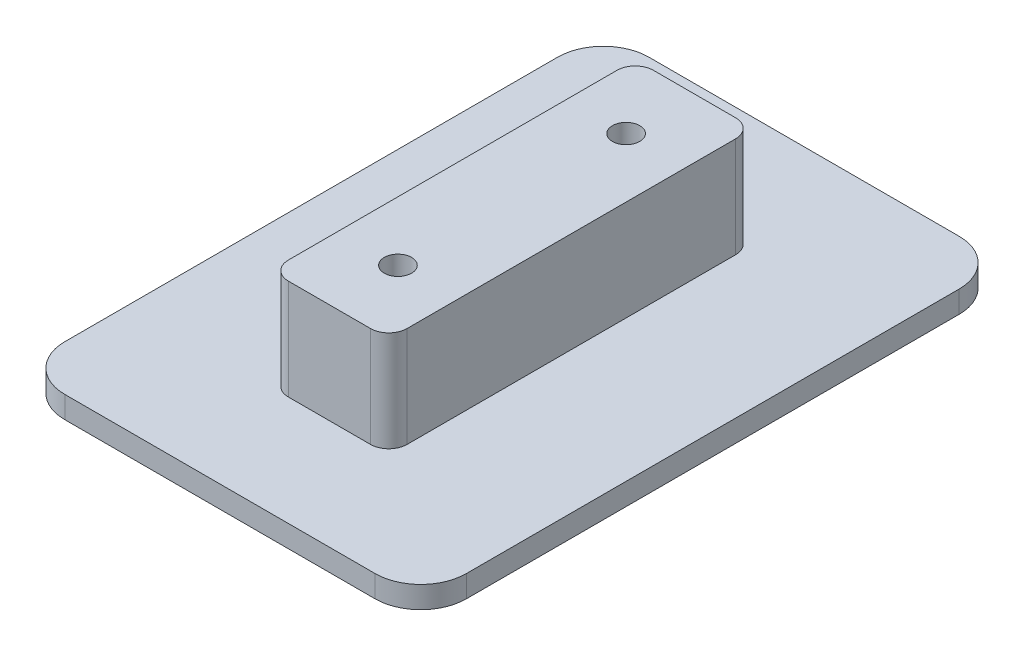
ISO-10303-21;
HEADER;
FILE_DESCRIPTION(('STEP AP214'),'2;1');
FILE_NAME('part.step','',(''),(''),'','','');
FILE_SCHEMA(('AUTOMOTIVE_DESIGN { 1 0 10303 214 1 1 1 1 }'));
ENDSEC;
DATA;
#1=APPLICATION_CONTEXT('core data for automotive mechanical design processes');
#2=APPLICATION_PROTOCOL_DEFINITION('international standard','automotive_design',2000,#1);
#3=PRODUCT_CONTEXT('',#1,'mechanical');
#4=PRODUCT('Part','Part','',(#3));
#5=PRODUCT_RELATED_PRODUCT_CATEGORY('part','',(#4));
#6=PRODUCT_DEFINITION_FORMATION('','',#4);
#7=PRODUCT_DEFINITION_CONTEXT('part definition',#1,'design');
#8=PRODUCT_DEFINITION('design','',#6,#7);
#9=PRODUCT_DEFINITION_SHAPE('','',#8);
#10=(LENGTH_UNIT() NAMED_UNIT(*) SI_UNIT(.MILLI.,.METRE.));
#11=(NAMED_UNIT(*) PLANE_ANGLE_UNIT() SI_UNIT($,.RADIAN.));
#12=(NAMED_UNIT(*) SI_UNIT($,.STERADIAN.) SOLID_ANGLE_UNIT());
#13=UNCERTAINTY_MEASURE_WITH_UNIT(LENGTH_MEASURE(1.E-05),#10,'distance_accuracy_value','');
#14=(GEOMETRIC_REPRESENTATION_CONTEXT(3) GLOBAL_UNCERTAINTY_ASSIGNED_CONTEXT((#13)) GLOBAL_UNIT_ASSIGNED_CONTEXT((#10,
#11,#12)) REPRESENTATION_CONTEXT('',''));
#15=CARTESIAN_POINT('',(0.,0.,0.));
#16=DIRECTION('',(0.,0.,1.));
#17=DIRECTION('',(1.,0.,0.));
#18=AXIS2_PLACEMENT_3D('',#15,#16,#17);
#19=CARTESIAN_POINT('',(85.,12.,-135.));
#20=DIRECTION('',(0.,-1.,0.));
#21=DIRECTION('',(0.,0.,-1.));
#22=AXIS2_PLACEMENT_3D('',#19,#20,#21);
#23=CYLINDRICAL_SURFACE('',#22,25.);
#24=CARTESIAN_POINT('',(85.,0.,-135.));
#25=DIRECTION('',(0.,1.,0.));
#26=DIRECTION('',(0.,0.,-1.));
#27=AXIS2_PLACEMENT_3D('',#24,#25,#26);
#28=CIRCLE('',#27,25.);
#29=CARTESIAN_POINT('',(110.,0.,-135.));
#30=VERTEX_POINT('',#29);
#31=CARTESIAN_POINT('',(84.9999999999998,0.,-160.));
#32=VERTEX_POINT('',#31);
#33=EDGE_CURVE('E176',#30,#32,#28,.T.);
#34=ORIENTED_EDGE('',*,*,#33,.T.);
#35=DIRECTION('',(0.,-1.,0.));
#36=VECTOR('',#35,1.);
#37=CARTESIAN_POINT('',(84.9999999999998,12.,-160.));
#38=LINE('',#37,#36);
#39=CARTESIAN_POINT('',(84.9999999999998,12.,-160.));
#40=VERTEX_POINT('',#39);
#41=EDGE_CURVE('E11',#40,#32,#38,.T.);
#42=ORIENTED_EDGE('',*,*,#41,.F.);
#43=CARTESIAN_POINT('',(85.,12.,-135.));
#44=DIRECTION('',(0.,1.,0.));
#45=DIRECTION('',(0.,0.,-1.));
#46=AXIS2_PLACEMENT_3D('',#43,#44,#45);
#47=CIRCLE('',#46,25.);
#48=CARTESIAN_POINT('',(110.,12.,-135.));
#49=VERTEX_POINT('',#48);
#50=EDGE_CURVE('E187',#49,#40,#47,.T.);
#51=ORIENTED_EDGE('',*,*,#50,.F.);
#52=DIRECTION('',(0.,-1.,0.));
#53=VECTOR('',#52,1.);
#54=CARTESIAN_POINT('',(110.,12.,-135.));
#55=LINE('',#54,#53);
#56=EDGE_CURVE('E212',#49,#30,#55,.T.);
#57=ORIENTED_EDGE('',*,*,#56,.T.);
#58=EDGE_LOOP('',(#34,#42,#51,#57));
#59=FACE_BOUND('',#58,.T.);
#60=ADVANCED_FACE('F39',(#59),#23,.T.);
#61=CARTESIAN_POINT('',(-84.9999999999998,12.,-160.));
#62=DIRECTION('',(0.,0.,1.));
#63=DIRECTION('',(1.,0.,0.));
#64=AXIS2_PLACEMENT_3D('',#61,#62,#63);
#65=PLANE('',#64);
#66=DIRECTION('',(-1.,0.,0.));
#67=VECTOR('',#66,1.);
#68=CARTESIAN_POINT('',(-84.9999999999998,0.,-160.));
#69=LINE('',#68,#67);
#70=CARTESIAN_POINT('',(-84.9999999999998,0.,-160.));
#71=VERTEX_POINT('',#70);
#72=EDGE_CURVE('E181',#32,#71,#69,.T.);
#73=ORIENTED_EDGE('',*,*,#72,.T.);
#74=DIRECTION('',(0.,-1.,0.));
#75=VECTOR('',#74,1.);
#76=CARTESIAN_POINT('',(-84.9999999999998,12.,-160.));
#77=LINE('',#76,#75);
#78=CARTESIAN_POINT('',(-84.9999999999998,12.,-160.));
#79=VERTEX_POINT('',#78);
#80=EDGE_CURVE('E47',#79,#71,#77,.T.);
#81=ORIENTED_EDGE('',*,*,#80,.F.);
#82=DIRECTION('',(-1.,0.,0.));
#83=VECTOR('',#82,1.);
#84=CARTESIAN_POINT('',(-84.9999999999998,12.,-160.));
#85=LINE('',#84,#83);
#86=EDGE_CURVE('E191',#40,#79,#85,.T.);
#87=ORIENTED_EDGE('',*,*,#86,.F.);
#88=ORIENTED_EDGE('',*,*,#41,.T.);
#89=EDGE_LOOP('',(#73,#81,#87,#88));
#90=FACE_BOUND('',#89,.T.);
#91=ADVANCED_FACE('F284',(#90),#65,.F.);
#92=CARTESIAN_POINT('',(-85.,12.,-135.));
#93=DIRECTION('',(0.,-1.,0.));
#94=DIRECTION('',(0.,0.,-1.));
#95=AXIS2_PLACEMENT_3D('',#92,#93,#94);
#96=CYLINDRICAL_SURFACE('',#95,25.);
#97=CARTESIAN_POINT('',(-85.,0.,-135.));
#98=DIRECTION('',(0.,1.,0.));
#99=DIRECTION('',(0.,0.,-1.));
#100=AXIS2_PLACEMENT_3D('',#97,#98,#99);
#101=CIRCLE('',#100,25.);
#102=CARTESIAN_POINT('',(-110.,0.,-135.));
#103=VERTEX_POINT('',#102);
#104=EDGE_CURVE('E216',#71,#103,#101,.T.);
#105=ORIENTED_EDGE('',*,*,#104,.T.);
#106=DIRECTION('',(0.,-1.,0.));
#107=VECTOR('',#106,1.);
#108=CARTESIAN_POINT('',(-110.,12.,-135.));
#109=LINE('',#108,#107);
#110=CARTESIAN_POINT('',(-110.,12.,-135.));
#111=VERTEX_POINT('',#110);
#112=EDGE_CURVE('E252',#111,#103,#109,.T.);
#113=ORIENTED_EDGE('',*,*,#112,.F.);
#114=CARTESIAN_POINT('',(-85.,12.,-135.));
#115=DIRECTION('',(0.,1.,0.));
#116=DIRECTION('',(0.,0.,-1.));
#117=AXIS2_PLACEMENT_3D('',#114,#115,#116);
#118=CIRCLE('',#117,25.);
#119=EDGE_CURVE('E195',#79,#111,#118,.T.);
#120=ORIENTED_EDGE('',*,*,#119,.F.);
#121=ORIENTED_EDGE('',*,*,#80,.T.);
#122=EDGE_LOOP('',(#105,#113,#120,#121));
#123=FACE_BOUND('',#122,.T.);
#124=ADVANCED_FACE('F261',(#123),#96,.T.);
#125=CARTESIAN_POINT('',(-110.,12.,-135.));
#126=DIRECTION('',(1.,0.,0.));
#127=DIRECTION('',(0.,0.,-1.));
#128=AXIS2_PLACEMENT_3D('',#125,#126,#127);
#129=PLANE('',#128);
#130=DIRECTION('',(0.,0.,1.));
#131=VECTOR('',#130,1.);
#132=CARTESIAN_POINT('',(-110.,0.,-135.));
#133=LINE('',#132,#131);
#134=CARTESIAN_POINT('',(-110.,0.,135.));
#135=VERTEX_POINT('',#134);
#136=EDGE_CURVE('E219',#103,#135,#133,.T.);
#137=ORIENTED_EDGE('',*,*,#136,.T.);
#138=DIRECTION('',(0.,-1.,0.));
#139=VECTOR('',#138,1.);
#140=CARTESIAN_POINT('',(-110.,12.,135.));
#141=LINE('',#140,#139);
#142=CARTESIAN_POINT('',(-110.,12.,135.));
#143=VERTEX_POINT('',#142);
#144=EDGE_CURVE('E248',#143,#135,#141,.T.);
#145=ORIENTED_EDGE('',*,*,#144,.F.);
#146=DIRECTION('',(0.,0.,1.));
#147=VECTOR('',#146,1.);
#148=CARTESIAN_POINT('',(-110.,12.,-135.));
#149=LINE('',#148,#147);
#150=EDGE_CURVE('E198',#111,#143,#149,.T.);
#151=ORIENTED_EDGE('',*,*,#150,.F.);
#152=ORIENTED_EDGE('',*,*,#112,.T.);
#153=EDGE_LOOP('',(#137,#145,#151,#152));
#154=FACE_BOUND('',#153,.T.);
#155=ADVANCED_FACE('F272',(#154),#129,.F.);
#156=CARTESIAN_POINT('',(-85.,12.,135.));
#157=DIRECTION('',(0.,-1.,0.));
#158=DIRECTION('',(0.,0.,-1.));
#159=AXIS2_PLACEMENT_3D('',#156,#157,#158);
#160=CYLINDRICAL_SURFACE('',#159,25.);
#161=CARTESIAN_POINT('',(-85.,0.,135.));
#162=DIRECTION('',(0.,1.,0.));
#163=DIRECTION('',(0.,0.,-1.));
#164=AXIS2_PLACEMENT_3D('',#161,#162,#163);
#165=CIRCLE('',#164,25.);
#166=CARTESIAN_POINT('',(-84.9999999999998,0.,160.));
#167=VERTEX_POINT('',#166);
#168=EDGE_CURVE('E222',#135,#167,#165,.T.);
#169=ORIENTED_EDGE('',*,*,#168,.T.);
#170=DIRECTION('',(0.,-1.,0.));
#171=VECTOR('',#170,1.);
#172=CARTESIAN_POINT('',(-84.9999999999998,12.,160.));
#173=LINE('',#172,#171);
#174=CARTESIAN_POINT('',(-84.9999999999998,12.,160.));
#175=VERTEX_POINT('',#174);
#176=EDGE_CURVE('E244',#175,#167,#173,.T.);
#177=ORIENTED_EDGE('',*,*,#176,.F.);
#178=CARTESIAN_POINT('',(-85.,12.,135.));
#179=DIRECTION('',(0.,1.,0.));
#180=DIRECTION('',(0.,0.,-1.));
#181=AXIS2_PLACEMENT_3D('',#178,#179,#180);
#182=CIRCLE('',#181,25.);
#183=EDGE_CURVE('E201',#143,#175,#182,.T.);
#184=ORIENTED_EDGE('',*,*,#183,.F.);
#185=ORIENTED_EDGE('',*,*,#144,.T.);
#186=EDGE_LOOP('',(#169,#177,#184,#185));
#187=FACE_BOUND('',#186,.T.);
#188=ADVANCED_FACE('F276',(#187),#160,.T.);
#189=CARTESIAN_POINT('',(-84.9999999999998,12.,160.));
#190=DIRECTION('',(0.,0.,-1.));
#191=DIRECTION('',(-1.,0.,0.));
#192=AXIS2_PLACEMENT_3D('',#189,#190,#191);
#193=PLANE('',#192);
#194=DIRECTION('',(1.,0.,0.));
#195=VECTOR('',#194,1.);
#196=CARTESIAN_POINT('',(-84.9999999999998,0.,160.));
#197=LINE('',#196,#195);
#198=CARTESIAN_POINT('',(84.9999999999999,0.,160.));
#199=VERTEX_POINT('',#198);
#200=EDGE_CURVE('E225',#167,#199,#197,.T.);
#201=ORIENTED_EDGE('',*,*,#200,.T.);
#202=DIRECTION('',(0.,-1.,0.));
#203=VECTOR('',#202,1.);
#204=CARTESIAN_POINT('',(84.9999999999999,12.,160.));
#205=LINE('',#204,#203);
#206=CARTESIAN_POINT('',(84.9999999999999,12.,160.));
#207=VERTEX_POINT('',#206);
#208=EDGE_CURVE('E240',#207,#199,#205,.T.);
#209=ORIENTED_EDGE('',*,*,#208,.F.);
#210=DIRECTION('',(1.,0.,0.));
#211=VECTOR('',#210,1.);
#212=CARTESIAN_POINT('',(-84.9999999999998,12.,160.));
#213=LINE('',#212,#211);
#214=EDGE_CURVE('E204',#175,#207,#213,.T.);
#215=ORIENTED_EDGE('',*,*,#214,.F.);
#216=ORIENTED_EDGE('',*,*,#176,.T.);
#217=EDGE_LOOP('',(#201,#209,#215,#216));
#218=FACE_BOUND('',#217,.T.);
#219=ADVANCED_FACE('F297',(#218),#193,.F.);
#220=CARTESIAN_POINT('',(85.,12.,135.));
#221=DIRECTION('',(0.,-1.,0.));
#222=DIRECTION('',(0.,0.,-1.));
#223=AXIS2_PLACEMENT_3D('',#220,#221,#222);
#224=CYLINDRICAL_SURFACE('',#223,25.);
#225=CARTESIAN_POINT('',(85.,0.,135.));
#226=DIRECTION('',(0.,1.,0.));
#227=DIRECTION('',(0.,0.,-1.));
#228=AXIS2_PLACEMENT_3D('',#225,#226,#227);
#229=CIRCLE('',#228,25.);
#230=CARTESIAN_POINT('',(110.,0.,135.));
#231=VERTEX_POINT('',#230);
#232=EDGE_CURVE('E228',#199,#231,#229,.T.);
#233=ORIENTED_EDGE('',*,*,#232,.T.);
#234=DIRECTION('',(0.,-1.,0.));
#235=VECTOR('',#234,1.);
#236=CARTESIAN_POINT('',(110.,12.,135.));
#237=LINE('',#236,#235);
#238=CARTESIAN_POINT('',(110.,12.,135.));
#239=VERTEX_POINT('',#238);
#240=EDGE_CURVE('E236',#239,#231,#237,.T.);
#241=ORIENTED_EDGE('',*,*,#240,.F.);
#242=CARTESIAN_POINT('',(85.,12.,135.));
#243=DIRECTION('',(0.,1.,0.));
#244=DIRECTION('',(0.,0.,-1.));
#245=AXIS2_PLACEMENT_3D('',#242,#243,#244);
#246=CIRCLE('',#245,25.);
#247=EDGE_CURVE('E207',#207,#239,#246,.T.);
#248=ORIENTED_EDGE('',*,*,#247,.F.);
#249=ORIENTED_EDGE('',*,*,#208,.T.);
#250=EDGE_LOOP('',(#233,#241,#248,#249));
#251=FACE_BOUND('',#250,.T.);
#252=ADVANCED_FACE('F295',(#251),#224,.T.);
#253=CARTESIAN_POINT('',(110.,12.,-135.));
#254=DIRECTION('',(-1.,0.,0.));
#255=DIRECTION('',(0.,0.,1.));
#256=AXIS2_PLACEMENT_3D('',#253,#254,#255);
#257=PLANE('',#256);
#258=DIRECTION('',(0.,0.,-1.));
#259=VECTOR('',#258,1.);
#260=CARTESIAN_POINT('',(110.,0.,-135.));
#261=LINE('',#260,#259);
#262=EDGE_CURVE('E192',#231,#30,#261,.T.);
#263=ORIENTED_EDGE('',*,*,#262,.T.);
#264=ORIENTED_EDGE('',*,*,#56,.F.);
#265=DIRECTION('',(0.,0.,-1.));
#266=VECTOR('',#265,1.);
#267=CARTESIAN_POINT('',(110.,12.,-135.));
#268=LINE('',#267,#266);
#269=EDGE_CURVE('E210',#239,#49,#268,.T.);
#270=ORIENTED_EDGE('',*,*,#269,.F.);
#271=ORIENTED_EDGE('',*,*,#240,.T.);
#272=EDGE_LOOP('',(#263,#264,#270,#271));
#273=FACE_BOUND('',#272,.T.);
#274=ADVANCED_FACE('F290',(#273),#257,.F.);
#275=CARTESIAN_POINT('',(85.,12.,-135.));
#276=DIRECTION('',(0.,-1.,0.));
#277=DIRECTION('',(0.,0.,-1.));
#278=AXIS2_PLACEMENT_3D('',#275,#276,#277);
#279=PLANE('',#278);
#280=CARTESIAN_POINT('',(-22.5,12.,90.));
#281=DIRECTION('',(0.,1.,0.));
#282=DIRECTION('',(0.,0.,-1.));
#283=AXIS2_PLACEMENT_3D('',#280,#281,#282);
#284=CIRCLE('',#283,10.);
#285=CARTESIAN_POINT('',(-32.5,12.,89.9999999999999));
#286=VERTEX_POINT('',#285);
#287=CARTESIAN_POINT('',(-22.4999999999999,12.,100.));
#288=VERTEX_POINT('',#287);
#289=EDGE_CURVE('E54',#286,#288,#284,.T.);
#290=ORIENTED_EDGE('',*,*,#289,.F.);
#291=DIRECTION('',(0.,0.,1.));
#292=VECTOR('',#291,1.);
#293=CARTESIAN_POINT('',(-32.5,12.,-89.9999999999999));
#294=LINE('',#293,#292);
#295=CARTESIAN_POINT('',(-32.5,12.,-89.9999999999999));
#296=VERTEX_POINT('',#295);
#297=EDGE_CURVE('E58',#296,#286,#294,.T.);
#298=ORIENTED_EDGE('',*,*,#297,.F.);
#299=CARTESIAN_POINT('',(-22.5,12.,-90.));
#300=DIRECTION('',(0.,1.,0.));
#301=DIRECTION('',(0.,0.,1.));
#302=AXIS2_PLACEMENT_3D('',#299,#300,#301);
#303=CIRCLE('',#302,10.);
#304=CARTESIAN_POINT('',(-22.4999999999999,12.,-100.));
#305=VERTEX_POINT('',#304);
#306=EDGE_CURVE('E541',#305,#296,#303,.T.);
#307=ORIENTED_EDGE('',*,*,#306,.F.);
#308=DIRECTION('',(-1.,0.,0.));
#309=VECTOR('',#308,1.);
#310=CARTESIAN_POINT('',(-22.4999999999999,12.,-100.));
#311=LINE('',#310,#309);
#312=CARTESIAN_POINT('',(22.4999999999999,12.,-100.));
#313=VERTEX_POINT('',#312);
#314=EDGE_CURVE('E537',#313,#305,#311,.T.);
#315=ORIENTED_EDGE('',*,*,#314,.F.);
#316=CARTESIAN_POINT('',(22.5,12.,-90.));
#317=DIRECTION('',(0.,1.,0.));
#318=DIRECTION('',(0.,0.,-1.));
#319=AXIS2_PLACEMENT_3D('',#316,#317,#318);
#320=CIRCLE('',#319,10.);
#321=CARTESIAN_POINT('',(32.5,12.,-90.));
#322=VERTEX_POINT('',#321);
#323=EDGE_CURVE('E533',#322,#313,#320,.T.);
#324=ORIENTED_EDGE('',*,*,#323,.F.);
#325=DIRECTION('',(0.,0.,-1.));
#326=VECTOR('',#325,1.);
#327=CARTESIAN_POINT('',(32.5,12.,-90.));
#328=LINE('',#327,#326);
#329=CARTESIAN_POINT('',(32.5,12.,89.9999999999999));
#330=VERTEX_POINT('',#329);
#331=EDGE_CURVE('E529',#330,#322,#328,.T.);
#332=ORIENTED_EDGE('',*,*,#331,.F.);
#333=CARTESIAN_POINT('',(22.5,12.,90.));
#334=DIRECTION('',(0.,1.,0.));
#335=DIRECTION('',(0.,0.,-1.));
#336=AXIS2_PLACEMENT_3D('',#333,#334,#335);
#337=CIRCLE('',#336,10.);
#338=CARTESIAN_POINT('',(22.4999999999999,12.,100.));
#339=VERTEX_POINT('',#338);
#340=EDGE_CURVE('E525',#339,#330,#337,.T.);
#341=ORIENTED_EDGE('',*,*,#340,.F.);
#342=DIRECTION('',(1.,0.,0.));
#343=VECTOR('',#342,1.);
#344=CARTESIAN_POINT('',(-22.4999999999999,12.,100.));
#345=LINE('',#344,#343);
#346=EDGE_CURVE('E522',#288,#339,#345,.T.);
#347=ORIENTED_EDGE('',*,*,#346,.F.);
#348=EDGE_LOOP('',(#290,#298,#307,#315,#324,#332,#341,#347));
#349=FACE_BOUND('',#348,.T.);
#350=ORIENTED_EDGE('',*,*,#50,.T.);
#351=ORIENTED_EDGE('',*,*,#86,.T.);
#352=ORIENTED_EDGE('',*,*,#119,.T.);
#353=ORIENTED_EDGE('',*,*,#150,.T.);
#354=ORIENTED_EDGE('',*,*,#183,.T.);
#355=ORIENTED_EDGE('',*,*,#214,.T.);
#356=ORIENTED_EDGE('',*,*,#247,.T.);
#357=ORIENTED_EDGE('',*,*,#269,.T.);
#358=EDGE_LOOP('',(#350,#351,#352,#353,#354,#355,#356,#357));
#359=FACE_BOUND('',#358,.T.);
#360=ADVANCED_FACE('F280',(#349,#359),#279,.F.);
#361=CARTESIAN_POINT('',(85.,0.,-135.));
#362=DIRECTION('',(0.,-1.,0.));
#363=DIRECTION('',(0.,0.,-1.));
#364=AXIS2_PLACEMENT_3D('',#361,#362,#363);
#365=PLANE('',#364);
#366=ORIENTED_EDGE('',*,*,#33,.F.);
#367=ORIENTED_EDGE('',*,*,#262,.F.);
#368=ORIENTED_EDGE('',*,*,#232,.F.);
#369=ORIENTED_EDGE('',*,*,#200,.F.);
#370=ORIENTED_EDGE('',*,*,#168,.F.);
#371=ORIENTED_EDGE('',*,*,#136,.F.);
#372=ORIENTED_EDGE('',*,*,#104,.F.);
#373=ORIENTED_EDGE('',*,*,#72,.F.);
#374=EDGE_LOOP('',(#366,#367,#368,#369,#370,#371,#372,#373));
#375=FACE_BOUND('',#374,.T.);
#376=ADVANCED_FACE('F267',(#375),#365,.T.);
#377=CARTESIAN_POINT('',(-22.5,67.,90.));
#378=DIRECTION('',(0.,-1.,0.));
#379=DIRECTION('',(0.,0.,-1.));
#380=AXIS2_PLACEMENT_3D('',#377,#378,#379);
#381=PLANE('',#380);
#382=CARTESIAN_POINT('',(-22.5,67.,90.));
#383=DIRECTION('',(0.,1.,0.));
#384=DIRECTION('',(0.,0.,-1.));
#385=AXIS2_PLACEMENT_3D('',#382,#383,#384);
#386=CIRCLE('',#385,10.);
#387=CARTESIAN_POINT('',(-32.5,67.,89.9999999999999));
#388=VERTEX_POINT('',#387);
#389=CARTESIAN_POINT('',(-22.4999999999999,67.,100.));
#390=VERTEX_POINT('',#389);
#391=EDGE_CURVE('E162',#388,#390,#386,.T.);
#392=ORIENTED_EDGE('',*,*,#391,.T.);
#393=DIRECTION('',(1.,0.,0.));
#394=VECTOR('',#393,1.);
#395=CARTESIAN_POINT('',(-22.4999999999999,67.,100.));
#396=LINE('',#395,#394);
#397=CARTESIAN_POINT('',(22.4999999999999,67.,100.));
#398=VERTEX_POINT('',#397);
#399=EDGE_CURVE('E150',#390,#398,#396,.T.);
#400=ORIENTED_EDGE('',*,*,#399,.T.);
#401=CARTESIAN_POINT('',(22.5,67.,90.));
#402=DIRECTION('',(0.,1.,0.));
#403=DIRECTION('',(0.,0.,-1.));
#404=AXIS2_PLACEMENT_3D('',#401,#402,#403);
#405=CIRCLE('',#404,10.);
#406=CARTESIAN_POINT('',(32.5,67.,89.9999999999999));
#407=VERTEX_POINT('',#406);
#408=EDGE_CURVE('E161',#398,#407,#405,.T.);
#409=ORIENTED_EDGE('',*,*,#408,.T.);
#410=DIRECTION('',(0.,0.,-1.));
#411=VECTOR('',#410,1.);
#412=CARTESIAN_POINT('',(32.5,67.,-90.));
#413=LINE('',#412,#411);
#414=CARTESIAN_POINT('',(32.5,67.,-90.));
#415=VERTEX_POINT('',#414);
#416=EDGE_CURVE('E505',#407,#415,#413,.T.);
#417=ORIENTED_EDGE('',*,*,#416,.T.);
#418=CARTESIAN_POINT('',(22.5,67.,-90.));
#419=DIRECTION('',(0.,1.,0.));
#420=DIRECTION('',(0.,0.,-1.));
#421=AXIS2_PLACEMENT_3D('',#418,#419,#420);
#422=CIRCLE('',#421,10.);
#423=CARTESIAN_POINT('',(22.4999999999999,67.,-100.));
#424=VERTEX_POINT('',#423);
#425=EDGE_CURVE('E508',#415,#424,#422,.T.);
#426=ORIENTED_EDGE('',*,*,#425,.T.);
#427=DIRECTION('',(-1.,0.,0.));
#428=VECTOR('',#427,1.);
#429=CARTESIAN_POINT('',(-22.4999999999999,67.,-100.));
#430=LINE('',#429,#428);
#431=CARTESIAN_POINT('',(-22.4999999999999,67.,-100.));
#432=VERTEX_POINT('',#431);
#433=EDGE_CURVE('E511',#424,#432,#430,.T.);
#434=ORIENTED_EDGE('',*,*,#433,.T.);
#435=CARTESIAN_POINT('',(-22.5,67.,-90.));
#436=DIRECTION('',(0.,1.,0.));
#437=DIRECTION('',(0.,0.,1.));
#438=AXIS2_PLACEMENT_3D('',#435,#436,#437);
#439=CIRCLE('',#438,10.);
#440=CARTESIAN_POINT('',(-32.5,67.,-89.9999999999999));
#441=VERTEX_POINT('',#440);
#442=EDGE_CURVE('E514',#432,#441,#439,.T.);
#443=ORIENTED_EDGE('',*,*,#442,.T.);
#444=DIRECTION('',(0.,0.,1.));
#445=VECTOR('',#444,1.);
#446=CARTESIAN_POINT('',(-32.5,67.,-89.9999999999999));
#447=LINE('',#446,#445);
#448=EDGE_CURVE('E168',#441,#388,#447,.T.);
#449=ORIENTED_EDGE('',*,*,#448,.T.);
#450=EDGE_LOOP('',(#392,#400,#409,#417,#426,#434,#443,#449));
#451=FACE_BOUND('',#450,.T.);
#452=CARTESIAN_POINT('',(0.,67.,-62.5));
#453=DIRECTION('',(0.,1.,0.));
#454=DIRECTION('',(0.,0.,1.));
#455=AXIS2_PLACEMENT_3D('',#452,#453,#454);
#456=CIRCLE('',#455,7.5);
#457=CARTESIAN_POINT('',(0.,67.,-55.));
#458=VERTEX_POINT('',#457);
#459=EDGE_CURVE('E496',#458,#458,#456,.T.);
#460=ORIENTED_EDGE('',*,*,#459,.F.);
#461=EDGE_LOOP('',(#460));
#462=FACE_BOUND('',#461,.T.);
#463=CARTESIAN_POINT('',(0.,67.,62.5));
#464=DIRECTION('',(0.,1.,0.));
#465=DIRECTION('',(0.,0.,1.));
#466=AXIS2_PLACEMENT_3D('',#463,#464,#465);
#467=CIRCLE('',#466,7.5);
#468=CARTESIAN_POINT('',(0.,67.,70.));
#469=VERTEX_POINT('',#468);
#470=EDGE_CURVE('E489',#469,#469,#467,.T.);
#471=ORIENTED_EDGE('',*,*,#470,.F.);
#472=EDGE_LOOP('',(#471));
#473=FACE_BOUND('',#472,.T.);
#474=ADVANCED_FACE('F165',(#451,#462,#473),#381,.F.);
#475=CARTESIAN_POINT('',(-22.5,67.,90.));
#476=DIRECTION('',(0.,-1.,0.));
#477=DIRECTION('',(0.,0.,-1.));
#478=AXIS2_PLACEMENT_3D('',#475,#476,#477);
#479=CYLINDRICAL_SURFACE('',#478,10.);
#480=ORIENTED_EDGE('',*,*,#289,.T.);
#481=DIRECTION('',(0.,-1.,0.));
#482=VECTOR('',#481,1.);
#483=CARTESIAN_POINT('',(-22.4999999999999,67.,100.));
#484=LINE('',#483,#482);
#485=EDGE_CURVE('E155',#390,#288,#484,.T.);
#486=ORIENTED_EDGE('',*,*,#485,.F.);
#487=ORIENTED_EDGE('',*,*,#391,.F.);
#488=DIRECTION('',(0.,-1.,0.));
#489=VECTOR('',#488,1.);
#490=CARTESIAN_POINT('',(-32.5,67.,89.9999999999999));
#491=LINE('',#490,#489);
#492=EDGE_CURVE('E519',#388,#286,#491,.T.);
#493=ORIENTED_EDGE('',*,*,#492,.T.);
#494=EDGE_LOOP('',(#480,#486,#487,#493));
#495=FACE_BOUND('',#494,.T.);
#496=ADVANCED_FACE('F174',(#495),#479,.T.);
#497=CARTESIAN_POINT('',(-22.4999999999999,67.,100.));
#498=DIRECTION('',(0.,0.,-1.));
#499=DIRECTION('',(-1.,0.,0.));
#500=AXIS2_PLACEMENT_3D('',#497,#498,#499);
#501=PLANE('',#500);
#502=ORIENTED_EDGE('',*,*,#346,.T.);
#503=DIRECTION('',(0.,-1.,0.));
#504=VECTOR('',#503,1.);
#505=CARTESIAN_POINT('',(22.4999999999999,67.,100.));
#506=LINE('',#505,#504);
#507=EDGE_CURVE('E157',#398,#339,#506,.T.);
#508=ORIENTED_EDGE('',*,*,#507,.F.);
#509=ORIENTED_EDGE('',*,*,#399,.F.);
#510=ORIENTED_EDGE('',*,*,#485,.T.);
#511=EDGE_LOOP('',(#502,#508,#509,#510));
#512=FACE_BOUND('',#511,.T.);
#513=ADVANCED_FACE('F153',(#512),#501,.F.);
#514=CARTESIAN_POINT('',(22.5,67.,90.));
#515=DIRECTION('',(0.,-1.,0.));
#516=DIRECTION('',(0.,0.,-1.));
#517=AXIS2_PLACEMENT_3D('',#514,#515,#516);
#518=CYLINDRICAL_SURFACE('',#517,10.);
#519=ORIENTED_EDGE('',*,*,#340,.T.);
#520=DIRECTION('',(0.,-1.,0.));
#521=VECTOR('',#520,1.);
#522=CARTESIAN_POINT('',(32.5,67.,89.9999999999999));
#523=LINE('',#522,#521);
#524=EDGE_CURVE('E183',#407,#330,#523,.T.);
#525=ORIENTED_EDGE('',*,*,#524,.F.);
#526=ORIENTED_EDGE('',*,*,#408,.F.);
#527=ORIENTED_EDGE('',*,*,#507,.T.);
#528=EDGE_LOOP('',(#519,#525,#526,#527));
#529=FACE_BOUND('',#528,.T.);
#530=ADVANCED_FACE('F387',(#529),#518,.T.);
#531=CARTESIAN_POINT('',(32.5,67.,-90.));
#532=DIRECTION('',(-1.,0.,0.));
#533=DIRECTION('',(0.,0.,1.));
#534=AXIS2_PLACEMENT_3D('',#531,#532,#533);
#535=PLANE('',#534);
#536=ORIENTED_EDGE('',*,*,#331,.T.);
#537=DIRECTION('',(0.,-1.,0.));
#538=VECTOR('',#537,1.);
#539=CARTESIAN_POINT('',(32.5,67.,-90.));
#540=LINE('',#539,#538);
#541=EDGE_CURVE('E560',#415,#322,#540,.T.);
#542=ORIENTED_EDGE('',*,*,#541,.F.);
#543=ORIENTED_EDGE('',*,*,#416,.F.);
#544=ORIENTED_EDGE('',*,*,#524,.T.);
#545=EDGE_LOOP('',(#536,#542,#543,#544));
#546=FACE_BOUND('',#545,.T.);
#547=ADVANCED_FACE('F396',(#546),#535,.F.);
#548=CARTESIAN_POINT('',(22.5,67.,-90.));
#549=DIRECTION('',(0.,-1.,0.));
#550=DIRECTION('',(0.,0.,-1.));
#551=AXIS2_PLACEMENT_3D('',#548,#549,#550);
#552=CYLINDRICAL_SURFACE('',#551,10.);
#553=ORIENTED_EDGE('',*,*,#323,.T.);
#554=DIRECTION('',(0.,-1.,0.));
#555=VECTOR('',#554,1.);
#556=CARTESIAN_POINT('',(22.4999999999999,67.,-100.));
#557=LINE('',#556,#555);
#558=EDGE_CURVE('E556',#424,#313,#557,.T.);
#559=ORIENTED_EDGE('',*,*,#558,.F.);
#560=ORIENTED_EDGE('',*,*,#425,.F.);
#561=ORIENTED_EDGE('',*,*,#541,.T.);
#562=EDGE_LOOP('',(#553,#559,#560,#561));
#563=FACE_BOUND('',#562,.T.);
#564=ADVANCED_FACE('F406',(#563),#552,.T.);
#565=CARTESIAN_POINT('',(-22.4999999999999,67.,-100.));
#566=DIRECTION('',(0.,0.,1.));
#567=DIRECTION('',(1.,0.,0.));
#568=AXIS2_PLACEMENT_3D('',#565,#566,#567);
#569=PLANE('',#568);
#570=ORIENTED_EDGE('',*,*,#314,.T.);
#571=DIRECTION('',(0.,-1.,0.));
#572=VECTOR('',#571,1.);
#573=CARTESIAN_POINT('',(-22.4999999999999,67.,-100.));
#574=LINE('',#573,#572);
#575=EDGE_CURVE('E552',#432,#305,#574,.T.);
#576=ORIENTED_EDGE('',*,*,#575,.F.);
#577=ORIENTED_EDGE('',*,*,#433,.F.);
#578=ORIENTED_EDGE('',*,*,#558,.T.);
#579=EDGE_LOOP('',(#570,#576,#577,#578));
#580=FACE_BOUND('',#579,.T.);
#581=ADVANCED_FACE('F416',(#580),#569,.F.);
#582=CARTESIAN_POINT('',(-22.5,67.,-90.));
#583=DIRECTION('',(0.,-1.,0.));
#584=DIRECTION('',(0.,0.,-1.));
#585=AXIS2_PLACEMENT_3D('',#582,#583,#584);
#586=CYLINDRICAL_SURFACE('',#585,10.);
#587=ORIENTED_EDGE('',*,*,#306,.T.);
#588=DIRECTION('',(0.,-1.,0.));
#589=VECTOR('',#588,1.);
#590=CARTESIAN_POINT('',(-32.5,67.,-89.9999999999999));
#591=LINE('',#590,#589);
#592=EDGE_CURVE('E548',#441,#296,#591,.T.);
#593=ORIENTED_EDGE('',*,*,#592,.F.);
#594=ORIENTED_EDGE('',*,*,#442,.F.);
#595=ORIENTED_EDGE('',*,*,#575,.T.);
#596=EDGE_LOOP('',(#587,#593,#594,#595));
#597=FACE_BOUND('',#596,.T.);
#598=ADVANCED_FACE('F426',(#597),#586,.T.);
#599=CARTESIAN_POINT('',(-32.5,67.,-89.9999999999999));
#600=DIRECTION('',(1.,0.,0.));
#601=DIRECTION('',(0.,0.,-1.));
#602=AXIS2_PLACEMENT_3D('',#599,#600,#601);
#603=PLANE('',#602);
#604=ORIENTED_EDGE('',*,*,#297,.T.);
#605=ORIENTED_EDGE('',*,*,#492,.F.);
#606=ORIENTED_EDGE('',*,*,#448,.F.);
#607=ORIENTED_EDGE('',*,*,#592,.T.);
#608=EDGE_LOOP('',(#604,#605,#606,#607));
#609=FACE_BOUND('',#608,.T.);
#610=ADVANCED_FACE('F436',(#609),#603,.F.);
#611=CARTESIAN_POINT('',(0.,67.,-62.5));
#612=DIRECTION('',(0.,-1.,0.));
#613=DIRECTION('',(0.,0.,-1.));
#614=AXIS2_PLACEMENT_3D('',#611,#612,#613);
#615=CYLINDRICAL_SURFACE('',#614,7.5);
#616=ORIENTED_EDGE('',*,*,#459,.T.);
#617=EDGE_LOOP('',(#616));
#618=FACE_BOUND('',#617,.T.);
#619=CARTESIAN_POINT('',(0.,12.,-62.5));
#620=DIRECTION('',(0.,1.,0.));
#621=DIRECTION('',(0.,0.,1.));
#622=AXIS2_PLACEMENT_3D('',#619,#620,#621);
#623=CIRCLE('',#622,7.5);
#624=CARTESIAN_POINT('',(0.,12.,-55.));
#625=VERTEX_POINT('',#624);
#626=EDGE_CURVE('E493',#625,#625,#623,.T.);
#627=ORIENTED_EDGE('',*,*,#626,.F.);
#628=EDGE_LOOP('',(#627));
#629=FACE_BOUND('',#628,.T.);
#630=ADVANCED_FACE('F446',(#618,#629),#615,.F.);
#631=CARTESIAN_POINT('',(0.,67.,62.5));
#632=DIRECTION('',(0.,-1.,0.));
#633=DIRECTION('',(0.,0.,-1.));
#634=AXIS2_PLACEMENT_3D('',#631,#632,#633);
#635=CYLINDRICAL_SURFACE('',#634,7.5);
#636=ORIENTED_EDGE('',*,*,#470,.T.);
#637=EDGE_LOOP('',(#636));
#638=FACE_BOUND('',#637,.T.);
#639=CARTESIAN_POINT('',(0.,12.,62.5));
#640=DIRECTION('',(0.,1.,0.));
#641=DIRECTION('',(0.,0.,1.));
#642=AXIS2_PLACEMENT_3D('',#639,#640,#641);
#643=CIRCLE('',#642,7.5);
#644=CARTESIAN_POINT('',(0.,12.,70.));
#645=VERTEX_POINT('',#644);
#646=EDGE_CURVE('E486',#645,#645,#643,.T.);
#647=ORIENTED_EDGE('',*,*,#646,.F.);
#648=EDGE_LOOP('',(#647));
#649=FACE_BOUND('',#648,.T.);
#650=ADVANCED_FACE('F456',(#638,#649),#635,.F.);
#651=ORIENTED_EDGE('',*,*,#626,.T.);
#652=EDGE_LOOP('',(#651));
#653=FACE_BOUND('',#652,.T.);
#654=ADVANCED_FACE('F362',(#653),#279,.F.);
#655=ORIENTED_EDGE('',*,*,#646,.T.);
#656=EDGE_LOOP('',(#655));
#657=FACE_BOUND('',#656,.T.);
#658=ADVANCED_FACE('F363',(#657),#279,.F.);
#659=CLOSED_SHELL('',(#60,#91,#124,#155,#188,#219,#252,#274,#360,#376,#474,#496,#513,#530,#547,
#564,#581,#598,#610,#630,#650,#654,#658));
#660=MANIFOLD_SOLID_BREP('B2',#659);
#661=ADVANCED_BREP_SHAPE_REPRESENTATION('',(#18,#660),#14);
#662=SHAPE_DEFINITION_REPRESENTATION(#9,#661);
ENDSEC;
END-ISO-10303-21;
